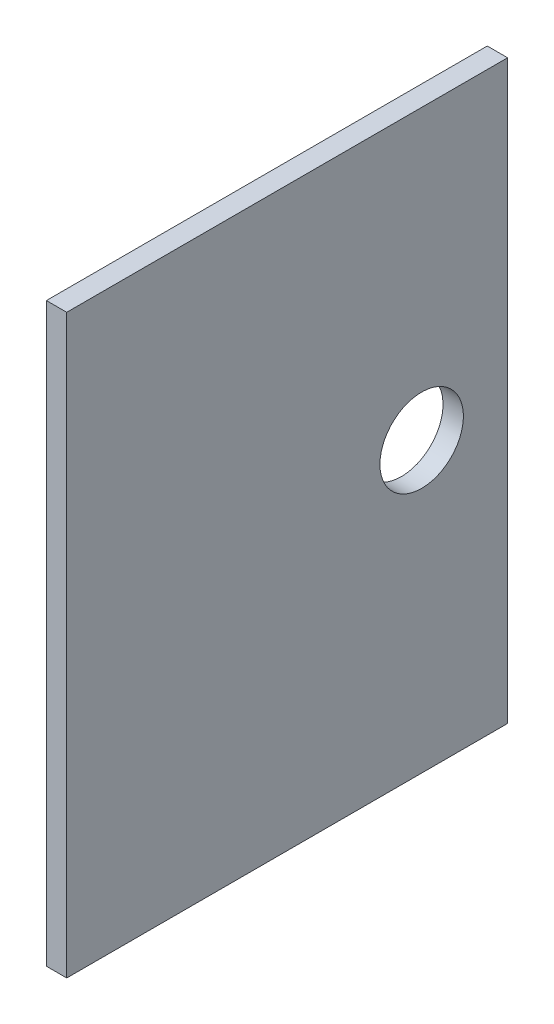
ISO-10303-21;
HEADER;
FILE_DESCRIPTION(('STEP AP214'),'2;1');
FILE_NAME('part.step','',(''),(''),'','','');
FILE_SCHEMA(('AUTOMOTIVE_DESIGN { 1 0 10303 214 1 1 1 1 }'));
ENDSEC;
DATA;
#1=APPLICATION_CONTEXT('core data for automotive mechanical design processes');
#2=APPLICATION_PROTOCOL_DEFINITION('international standard','automotive_design',2000,#1);
#3=PRODUCT_CONTEXT('',#1,'mechanical');
#4=PRODUCT('Part','Part','',(#3));
#5=PRODUCT_RELATED_PRODUCT_CATEGORY('part','',(#4));
#6=PRODUCT_DEFINITION_FORMATION('','',#4);
#7=PRODUCT_DEFINITION_CONTEXT('part definition',#1,'design');
#8=PRODUCT_DEFINITION('design','',#6,#7);
#9=PRODUCT_DEFINITION_SHAPE('','',#8);
#10=(LENGTH_UNIT() NAMED_UNIT(*) SI_UNIT(.MILLI.,.METRE.));
#11=(NAMED_UNIT(*) PLANE_ANGLE_UNIT() SI_UNIT($,.RADIAN.));
#12=(NAMED_UNIT(*) SI_UNIT($,.STERADIAN.) SOLID_ANGLE_UNIT());
#13=UNCERTAINTY_MEASURE_WITH_UNIT(LENGTH_MEASURE(1.E-05),#10,'distance_accuracy_value','');
#14=(GEOMETRIC_REPRESENTATION_CONTEXT(3) GLOBAL_UNCERTAINTY_ASSIGNED_CONTEXT((#13)) GLOBAL_UNIT_ASSIGNED_CONTEXT((#10,
#11,#12)) REPRESENTATION_CONTEXT('',''));
#15=CARTESIAN_POINT('',(0.,0.,0.));
#16=DIRECTION('',(0.,0.,1.));
#17=DIRECTION('',(1.,0.,0.));
#18=AXIS2_PLACEMENT_3D('',#15,#16,#17);
#19=CARTESIAN_POINT('',(7.62,0.,0.));
#20=DIRECTION('',(-1.,0.,0.));
#21=DIRECTION('',(0.,0.,1.));
#22=AXIS2_PLACEMENT_3D('',#19,#20,#21);
#23=PLANE('',#22);
#24=DIRECTION('',(0.,1.,0.));
#25=VECTOR('',#24,1.);
#26=CARTESIAN_POINT('',(7.62,-107.95,-82.55));
#27=LINE('',#26,#25);
#28=CARTESIAN_POINT('',(7.62,-107.95,-82.55));
#29=VERTEX_POINT('',#28);
#30=CARTESIAN_POINT('',(7.62,107.95,-82.55));
#31=VERTEX_POINT('',#30);
#32=EDGE_CURVE('E85',#29,#31,#27,.T.);
#33=ORIENTED_EDGE('',*,*,#32,.T.);
#34=DIRECTION('',(0.,0.,1.));
#35=VECTOR('',#34,1.);
#36=CARTESIAN_POINT('',(7.62,107.95,82.55));
#37=LINE('',#36,#35);
#38=CARTESIAN_POINT('',(7.62,107.95,82.55));
#39=VERTEX_POINT('',#38);
#40=EDGE_CURVE('E80',#31,#39,#37,.T.);
#41=ORIENTED_EDGE('',*,*,#40,.T.);
#42=DIRECTION('',(0.,-1.,0.));
#43=VECTOR('',#42,1.);
#44=CARTESIAN_POINT('',(7.62,-107.95,82.55));
#45=LINE('',#44,#43);
#46=CARTESIAN_POINT('',(7.62,-107.95,82.55));
#47=VERTEX_POINT('',#46);
#48=EDGE_CURVE('E83',#39,#47,#45,.T.);
#49=ORIENTED_EDGE('',*,*,#48,.T.);
#50=DIRECTION('',(0.,0.,-1.));
#51=VECTOR('',#50,1.);
#52=CARTESIAN_POINT('',(7.62,-107.95,82.55));
#53=LINE('',#52,#51);
#54=EDGE_CURVE('E50',#47,#29,#53,.T.);
#55=ORIENTED_EDGE('',*,*,#54,.T.);
#56=EDGE_LOOP('',(#33,#41,#49,#55));
#57=FACE_BOUND('',#56,.T.);
#58=CARTESIAN_POINT('',(7.62,0.,-50.3611296639477));
#59=DIRECTION('',(1.,0.,0.));
#60=DIRECTION('',(0.,0.,-1.));
#61=AXIS2_PLACEMENT_3D('',#58,#59,#60);
#62=CIRCLE('',#61,15.621);
#63=CARTESIAN_POINT('',(7.62,0.,-34.7401296639477));
#64=VERTEX_POINT('',#63);
#65=EDGE_CURVE('E100',#64,#64,#62,.T.);
#66=ORIENTED_EDGE('',*,*,#65,.F.);
#67=EDGE_LOOP('',(#66));
#68=FACE_BOUND('',#67,.T.);
#69=ADVANCED_FACE('F33',(#57,#68),#23,.F.);
#70=CARTESIAN_POINT('',(0.,0.,0.));
#71=DIRECTION('',(-1.,0.,0.));
#72=DIRECTION('',(0.,0.,1.));
#73=AXIS2_PLACEMENT_3D('',#70,#71,#72);
#74=PLANE('',#73);
#75=DIRECTION('',(0.,1.,0.));
#76=VECTOR('',#75,1.);
#77=CARTESIAN_POINT('',(0.,-107.95,-82.55));
#78=LINE('',#77,#76);
#79=CARTESIAN_POINT('',(0.,-107.95,-82.55));
#80=VERTEX_POINT('',#79);
#81=CARTESIAN_POINT('',(0.,107.95,-82.55));
#82=VERTEX_POINT('',#81);
#83=EDGE_CURVE('E97',#80,#82,#78,.T.);
#84=ORIENTED_EDGE('',*,*,#83,.F.);
#85=DIRECTION('',(0.,0.,-1.));
#86=VECTOR('',#85,1.);
#87=CARTESIAN_POINT('',(0.,-107.95,82.55));
#88=LINE('',#87,#86);
#89=CARTESIAN_POINT('',(0.,-107.95,82.55));
#90=VERTEX_POINT('',#89);
#91=EDGE_CURVE('E73',#90,#80,#88,.T.);
#92=ORIENTED_EDGE('',*,*,#91,.F.);
#93=DIRECTION('',(0.,-1.,0.));
#94=VECTOR('',#93,1.);
#95=CARTESIAN_POINT('',(0.,-107.95,82.55));
#96=LINE('',#95,#94);
#97=CARTESIAN_POINT('',(0.,107.95,82.55));
#98=VERTEX_POINT('',#97);
#99=EDGE_CURVE('E67',#98,#90,#96,.T.);
#100=ORIENTED_EDGE('',*,*,#99,.F.);
#101=DIRECTION('',(0.,0.,1.));
#102=VECTOR('',#101,1.);
#103=CARTESIAN_POINT('',(0.,107.95,82.55));
#104=LINE('',#103,#102);
#105=EDGE_CURVE('E89',#82,#98,#104,.T.);
#106=ORIENTED_EDGE('',*,*,#105,.F.);
#107=EDGE_LOOP('',(#84,#92,#100,#106));
#108=FACE_BOUND('',#107,.T.);
#109=CARTESIAN_POINT('',(0.,0.,-50.3611296639477));
#110=DIRECTION('',(1.,0.,0.));
#111=DIRECTION('',(0.,0.,-1.));
#112=AXIS2_PLACEMENT_3D('',#109,#110,#111);
#113=CIRCLE('',#112,15.621);
#114=CARTESIAN_POINT('',(0.,0.,-34.7401296639477));
#115=VERTEX_POINT('',#114);
#116=EDGE_CURVE('E112',#115,#115,#113,.T.);
#117=ORIENTED_EDGE('',*,*,#116,.T.);
#118=EDGE_LOOP('',(#117));
#119=FACE_BOUND('',#118,.T.);
#120=ADVANCED_FACE('F108',(#108,#119),#74,.T.);
#121=CARTESIAN_POINT('',(7.62,-107.95,-82.55));
#122=DIRECTION('',(0.,0.,1.));
#123=DIRECTION('',(1.,0.,0.));
#124=AXIS2_PLACEMENT_3D('',#121,#122,#123);
#125=PLANE('',#124);
#126=ORIENTED_EDGE('',*,*,#83,.T.);
#127=DIRECTION('',(-1.,0.,0.));
#128=VECTOR('',#127,1.);
#129=CARTESIAN_POINT('',(7.62,107.95,-82.55));
#130=LINE('',#129,#128);
#131=EDGE_CURVE('E11',#31,#82,#130,.T.);
#132=ORIENTED_EDGE('',*,*,#131,.F.);
#133=ORIENTED_EDGE('',*,*,#32,.F.);
#134=DIRECTION('',(-1.,0.,0.));
#135=VECTOR('',#134,1.);
#136=CARTESIAN_POINT('',(7.62,-107.95,-82.55));
#137=LINE('',#136,#135);
#138=EDGE_CURVE('E93',#29,#80,#137,.T.);
#139=ORIENTED_EDGE('',*,*,#138,.T.);
#140=EDGE_LOOP('',(#126,#132,#133,#139));
#141=FACE_BOUND('',#140,.T.);
#142=ADVANCED_FACE('F35',(#141),#125,.F.);
#143=CARTESIAN_POINT('',(7.62,107.95,82.55));
#144=DIRECTION('',(0.,-1.,0.));
#145=DIRECTION('',(0.,0.,-1.));
#146=AXIS2_PLACEMENT_3D('',#143,#144,#145);
#147=PLANE('',#146);
#148=ORIENTED_EDGE('',*,*,#105,.T.);
#149=DIRECTION('',(-1.,0.,0.));
#150=VECTOR('',#149,1.);
#151=CARTESIAN_POINT('',(7.62,107.95,82.55));
#152=LINE('',#151,#150);
#153=EDGE_CURVE('E42',#39,#98,#152,.T.);
#154=ORIENTED_EDGE('',*,*,#153,.F.);
#155=ORIENTED_EDGE('',*,*,#40,.F.);
#156=ORIENTED_EDGE('',*,*,#131,.T.);
#157=EDGE_LOOP('',(#148,#154,#155,#156));
#158=FACE_BOUND('',#157,.T.);
#159=ADVANCED_FACE('F88',(#158),#147,.F.);
#160=CARTESIAN_POINT('',(7.62,-107.95,82.55));
#161=DIRECTION('',(0.,0.,-1.));
#162=DIRECTION('',(-1.,0.,0.));
#163=AXIS2_PLACEMENT_3D('',#160,#161,#162);
#164=PLANE('',#163);
#165=ORIENTED_EDGE('',*,*,#99,.T.);
#166=DIRECTION('',(-1.,0.,0.));
#167=VECTOR('',#166,1.);
#168=CARTESIAN_POINT('',(7.62,-107.95,82.55));
#169=LINE('',#168,#167);
#170=EDGE_CURVE('E90',#47,#90,#169,.T.);
#171=ORIENTED_EDGE('',*,*,#170,.F.);
#172=ORIENTED_EDGE('',*,*,#48,.F.);
#173=ORIENTED_EDGE('',*,*,#153,.T.);
#174=EDGE_LOOP('',(#165,#171,#172,#173));
#175=FACE_BOUND('',#174,.T.);
#176=ADVANCED_FACE('F91',(#175),#164,.F.);
#177=CARTESIAN_POINT('',(7.62,-107.95,82.55));
#178=DIRECTION('',(0.,1.,0.));
#179=DIRECTION('',(0.,0.,1.));
#180=AXIS2_PLACEMENT_3D('',#177,#178,#179);
#181=PLANE('',#180);
#182=ORIENTED_EDGE('',*,*,#91,.T.);
#183=ORIENTED_EDGE('',*,*,#138,.F.);
#184=ORIENTED_EDGE('',*,*,#54,.F.);
#185=ORIENTED_EDGE('',*,*,#170,.T.);
#186=EDGE_LOOP('',(#182,#183,#184,#185));
#187=FACE_BOUND('',#186,.T.);
#188=ADVANCED_FACE('F105',(#187),#181,.F.);
#189=CARTESIAN_POINT('',(7.62,0.,-50.3611296639477));
#190=DIRECTION('',(-1.,0.,0.));
#191=DIRECTION('',(0.,0.,1.));
#192=AXIS2_PLACEMENT_3D('',#189,#190,#191);
#193=CYLINDRICAL_SURFACE('',#192,15.621);
#194=CARTESIAN_POINT('',(7.62,0.,-34.7401296639477));
#195=CARTESIAN_POINT('',(7.540625,0.,-34.7401296639477));
#196=CARTESIAN_POINT('',(7.46125,0.,-34.7401296639477));
#197=CARTESIAN_POINT('',(7.3025,0.,-34.7401296639477));
#198=CARTESIAN_POINT('',(7.223125,0.,-34.7401296639477));
#199=CARTESIAN_POINT('',(7.064375,0.,-34.7401296639477));
#200=CARTESIAN_POINT('',(6.985,0.,-34.7401296639477));
#201=CARTESIAN_POINT('',(6.82625,0.,-34.7401296639477));
#202=CARTESIAN_POINT('',(6.746875,0.,-34.7401296639477));
#203=CARTESIAN_POINT('',(6.588125,0.,-34.7401296639477));
#204=CARTESIAN_POINT('',(6.50875,0.,-34.7401296639477));
#205=CARTESIAN_POINT('',(6.35,0.,-34.7401296639477));
#206=CARTESIAN_POINT('',(6.270625,0.,-34.7401296639477));
#207=CARTESIAN_POINT('',(6.111875,0.,-34.7401296639477));
#208=CARTESIAN_POINT('',(6.0325,0.,-34.7401296639477));
#209=CARTESIAN_POINT('',(5.87375,0.,-34.7401296639477));
#210=CARTESIAN_POINT('',(5.794375,0.,-34.7401296639477));
#211=CARTESIAN_POINT('',(5.635625,0.,-34.7401296639477));
#212=CARTESIAN_POINT('',(5.55625,0.,-34.7401296639477));
#213=CARTESIAN_POINT('',(5.3975,0.,-34.7401296639477));
#214=CARTESIAN_POINT('',(5.318125,0.,-34.7401296639477));
#215=CARTESIAN_POINT('',(5.159375,0.,-34.7401296639477));
#216=CARTESIAN_POINT('',(5.08,0.,-34.7401296639477));
#217=CARTESIAN_POINT('',(4.92125,0.,-34.7401296639477));
#218=CARTESIAN_POINT('',(4.841875,0.,-34.7401296639477));
#219=CARTESIAN_POINT('',(4.683125,0.,-34.7401296639477));
#220=CARTESIAN_POINT('',(4.60375,0.,-34.7401296639477));
#221=CARTESIAN_POINT('',(4.445,0.,-34.7401296639477));
#222=CARTESIAN_POINT('',(4.365625,0.,-34.7401296639477));
#223=CARTESIAN_POINT('',(4.206875,0.,-34.7401296639477));
#224=CARTESIAN_POINT('',(4.1275,0.,-34.7401296639477));
#225=CARTESIAN_POINT('',(3.96875,0.,-34.7401296639477));
#226=CARTESIAN_POINT('',(3.889375,0.,-34.7401296639477));
#227=CARTESIAN_POINT('',(3.730625,0.,-34.7401296639477));
#228=CARTESIAN_POINT('',(3.65125,0.,-34.7401296639477));
#229=CARTESIAN_POINT('',(3.4925,0.,-34.7401296639477));
#230=CARTESIAN_POINT('',(3.413125,0.,-34.7401296639477));
#231=CARTESIAN_POINT('',(3.254375,0.,-34.7401296639477));
#232=CARTESIAN_POINT('',(3.175,0.,-34.7401296639477));
#233=CARTESIAN_POINT('',(3.01625,0.,-34.7401296639477));
#234=CARTESIAN_POINT('',(2.936875,0.,-34.7401296639477));
#235=CARTESIAN_POINT('',(2.778125,0.,-34.7401296639477));
#236=CARTESIAN_POINT('',(2.69875,0.,-34.7401296639477));
#237=CARTESIAN_POINT('',(2.54,0.,-34.7401296639477));
#238=CARTESIAN_POINT('',(2.460625,0.,-34.7401296639477));
#239=CARTESIAN_POINT('',(2.301875,0.,-34.7401296639477));
#240=CARTESIAN_POINT('',(2.2225,0.,-34.7401296639477));
#241=CARTESIAN_POINT('',(2.06375,0.,-34.7401296639477));
#242=CARTESIAN_POINT('',(1.984375,0.,-34.7401296639477));
#243=CARTESIAN_POINT('',(1.825625,0.,-34.7401296639477));
#244=CARTESIAN_POINT('',(1.74625,0.,-34.7401296639477));
#245=CARTESIAN_POINT('',(1.5875,0.,-34.7401296639477));
#246=CARTESIAN_POINT('',(1.508125,0.,-34.7401296639477));
#247=CARTESIAN_POINT('',(1.349375,0.,-34.7401296639477));
#248=CARTESIAN_POINT('',(1.27,0.,-34.7401296639477));
#249=CARTESIAN_POINT('',(1.11125,0.,-34.7401296639477));
#250=CARTESIAN_POINT('',(1.031875,0.,-34.7401296639477));
#251=CARTESIAN_POINT('',(0.873125,0.,-34.7401296639477));
#252=CARTESIAN_POINT('',(0.79375,0.,-34.7401296639477));
#253=CARTESIAN_POINT('',(0.635,0.,-34.7401296639477));
#254=CARTESIAN_POINT('',(0.555625,0.,-34.7401296639477));
#255=CARTESIAN_POINT('',(0.396875,0.,-34.7401296639477));
#256=CARTESIAN_POINT('',(0.3175,0.,-34.7401296639477));
#257=CARTESIAN_POINT('',(0.15875,0.,-34.7401296639477));
#258=CARTESIAN_POINT('',(0.0793749999999999,0.,-34.7401296639477));
#259=CARTESIAN_POINT('',(0.,0.,-34.7401296639477));
#260=B_SPLINE_CURVE_WITH_KNOTS('',3,(#194,#195,#196,#197,#198,#199,#200,#201,#202,#203,#204,
#205,#206,#207,#208,#209,#210,#211,#212,#213,#214,#215,#216,#217,#218,#219,#220,#221,#222,#223,
#224,#225,#226,#227,#228,#229,#230,#231,#232,#233,#234,#235,#236,#237,#238,#239,#240,#241,#242,
#243,#244,#245,#246,#247,#248,#249,#250,#251,#252,#253,#254,#255,#256,#257,#258,#259),
.UNSPECIFIED.,.F.,.F.,(4,2,2,2,2,2,2,2,2,2,2,2,2,2,2,2,2,2,2,2,2,2,2,2,2,2,2,2,2,2,2,2,4),(0.,
0.238125,0.47625,0.714375000000001,0.9525,1.190625,1.42875,1.666875,1.905,2.143125,2.38125,
2.619375,2.8575,3.095625,3.33375,3.571875,3.81,4.048125,4.28625,4.524375,4.7625,5.000625,
5.23875,5.476875,5.715,5.953125,6.19125,6.429375,6.6675,6.905625,7.14375,7.381875,7.62),.UNSPECIFIED.);
#261=EDGE_CURVE('BSEAM118',#64,#115,#260,.T.);
#262=ORIENTED_EDGE('',*,*,#65,.T.);
#263=ORIENTED_EDGE('',*,*,#116,.F.);
#264=ORIENTED_EDGE('',*,*,#261,.T.);
#265=ORIENTED_EDGE('',*,*,#261,.F.);
#266=EDGE_LOOP('',(#262,#264,#263,#265));
#267=FACE_BOUND('',#266,.T.);
#268=ADVANCED_FACE('F118',(#267),#193,.F.);
#269=CLOSED_SHELL('',(#69,#120,#142,#159,#176,#188,#268));
#270=MANIFOLD_SOLID_BREP('B2',#269);
#271=ADVANCED_BREP_SHAPE_REPRESENTATION('',(#18,#270),#14);
#272=SHAPE_DEFINITION_REPRESENTATION(#9,#271);
ENDSEC;
END-ISO-10303-21;
